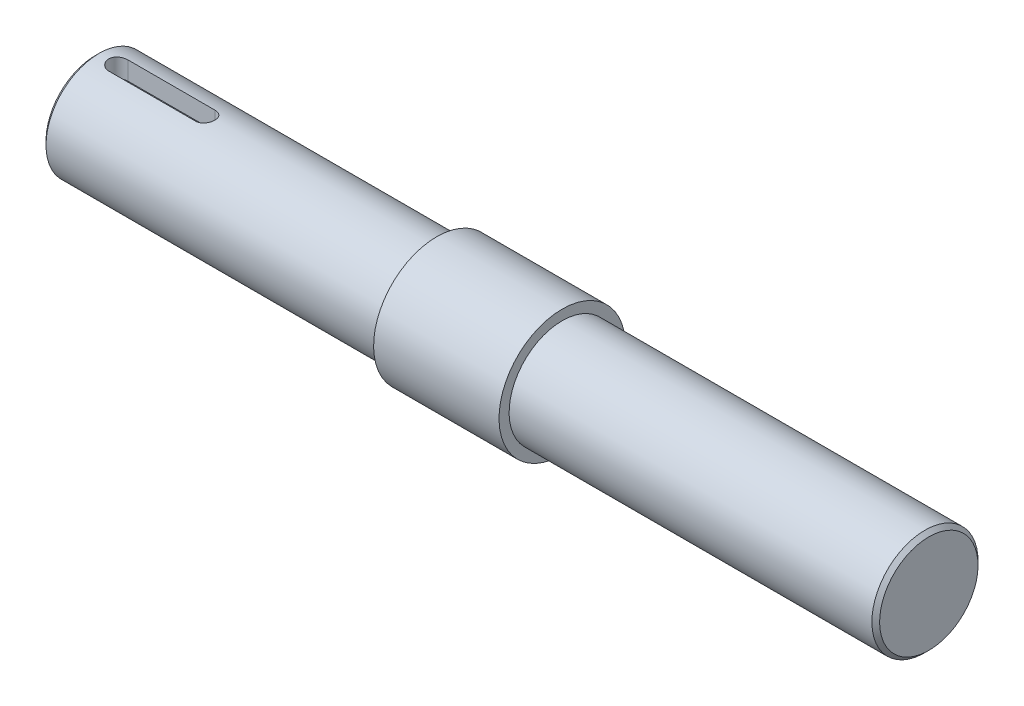
ISO-10303-21;
HEADER;
FILE_DESCRIPTION(('STEP AP214'),'2;1');
FILE_NAME('part.step','',(''),(''),'','','');
FILE_SCHEMA(('AUTOMOTIVE_DESIGN { 1 0 10303 214 1 1 1 1 }'));
ENDSEC;
DATA;
#1=APPLICATION_CONTEXT('core data for automotive mechanical design processes');
#2=APPLICATION_PROTOCOL_DEFINITION('international standard','automotive_design',2000,#1);
#3=PRODUCT_CONTEXT('',#1,'mechanical');
#4=PRODUCT('Part','Part','',(#3));
#5=PRODUCT_RELATED_PRODUCT_CATEGORY('part','',(#4));
#6=PRODUCT_DEFINITION_FORMATION('','',#4);
#7=PRODUCT_DEFINITION_CONTEXT('part definition',#1,'design');
#8=PRODUCT_DEFINITION('design','',#6,#7);
#9=PRODUCT_DEFINITION_SHAPE('','',#8);
#10=(LENGTH_UNIT() NAMED_UNIT(*) SI_UNIT(.MILLI.,.METRE.));
#11=(NAMED_UNIT(*) PLANE_ANGLE_UNIT() SI_UNIT($,.RADIAN.));
#12=(NAMED_UNIT(*) SI_UNIT($,.STERADIAN.) SOLID_ANGLE_UNIT());
#13=UNCERTAINTY_MEASURE_WITH_UNIT(LENGTH_MEASURE(1.E-05),#10,'distance_accuracy_value','');
#14=(GEOMETRIC_REPRESENTATION_CONTEXT(3) GLOBAL_UNCERTAINTY_ASSIGNED_CONTEXT((#13)) GLOBAL_UNIT_ASSIGNED_CONTEXT((#10,
#11,#12)) REPRESENTATION_CONTEXT('',''));
#15=CARTESIAN_POINT('',(0.,0.,0.));
#16=DIRECTION('',(0.,0.,1.));
#17=DIRECTION('',(1.,0.,0.));
#18=AXIS2_PLACEMENT_3D('',#15,#16,#17);
#19=CARTESIAN_POINT('',(432.,0.,0.));
#20=DIRECTION('',(1.,0.,0.));
#21=DIRECTION('',(0.,1.,0.));
#22=AXIS2_PLACEMENT_3D('',#19,#20,#21);
#23=CYLINDRICAL_SURFACE('',#22,27.5);
#24=CARTESIAN_POINT('',(11.9999999999999,27.0416345659799,-5.));
#25=CARTESIAN_POINT('',(11.8606128382279,27.0416233164666,-5.00001640047814));
#26=CARTESIAN_POINT('',(11.7212296097938,27.0427118990643,-4.99417207876341));
#27=CARTESIAN_POINT('',(11.4434835545277,27.0470071251589,-4.97088165476614));
#28=CARTESIAN_POINT('',(11.3051206169022,27.0502135351512,-4.95343683151582));
#29=CARTESIAN_POINT('',(11.0305858942771,27.0586570214069,-4.90709698702258));
#30=CARTESIAN_POINT('',(10.8944113512541,27.0638912918017,-4.87821778585737));
#31=CARTESIAN_POINT('',(10.6250227568617,27.0762343744052,-4.80923765177022));
#32=CARTESIAN_POINT('',(10.4918087089852,27.0833431888253,-4.76913670560913));
#33=CARTESIAN_POINT('',(10.2292763445926,27.0992304232334,-4.67801719247479));
#34=CARTESIAN_POINT('',(10.0999579225758,27.1080087979594,-4.62699892146665));
#35=CARTESIAN_POINT('',(9.84605587285056,27.126987322125,-4.51440118222781));
#36=CARTESIAN_POINT('',(9.7214740169367,27.137187997069,-4.4528178085087));
#37=CARTESIAN_POINT('',(9.47798148660962,27.1587163370771,-4.31956912661447));
#38=CARTESIAN_POINT('',(9.35906894048211,27.1700436263259,-4.24790717716446));
#39=CARTESIAN_POINT('',(9.12762439842264,27.1935154030165,-4.09496101451073));
#40=CARTESIAN_POINT('',(9.0150948030954,27.2056601942119,-4.01367321608594));
#41=CARTESIAN_POINT('',(8.79612162564765,27.2305505562545,-3.84119532707431));
#42=CARTESIAN_POINT('',(8.68975023312988,27.2433009237023,-3.74991426640209));
#43=CARTESIAN_POINT('',(8.48501344393681,27.2689348666358,-3.55872097822225));
#44=CARTESIAN_POINT('',(8.38665102741386,27.2818184897146,-3.45880556610794));
#45=CARTESIAN_POINT('',(8.19866770243193,27.3073516664494,-3.25107533173314));
#46=CARTESIAN_POINT('',(8.10904494230198,27.3200012692251,-3.14326219127829));
#47=CARTESIAN_POINT('',(7.93910636492097,27.344721337139,-2.92040850969684));
#48=CARTESIAN_POINT('',(7.85879399085384,27.356791587059,-2.80536531884152));
#49=CARTESIAN_POINT('',(7.70756988865483,27.3800901100507,-2.56806772558277));
#50=CARTESIAN_POINT('',(7.63672560208524,27.3913121183892,-2.44576971232371));
#51=CARTESIAN_POINT('',(7.50557885491204,27.4125086455947,-2.19548331573487));
#52=CARTESIAN_POINT('',(7.44528033841372,27.4224826973323,-2.06749282577724));
#53=CARTESIAN_POINT('',(7.33573794742342,27.440889636804,-1.80682984542478));
#54=CARTESIAN_POINT('',(7.28648871101171,27.4493232716902,-1.67415966228921));
#55=CARTESIAN_POINT('',(7.19937066271425,27.4644170112038,-1.40498439889688));
#56=CARTESIAN_POINT('',(7.16150598414174,27.4710764715942,-1.26847794545276));
#57=CARTESIAN_POINT('',(7.09784468584322,27.4823606318783,-0.994209294300366));
#58=CARTESIAN_POINT('',(7.071916679765,27.4870074493857,-0.85647865982843));
#59=CARTESIAN_POINT('',(7.03169017162005,27.4942493330537,-0.579279914156421));
#60=CARTESIAN_POINT('',(7.01739570895803,27.4968436865481,-0.439811216516837));
#61=CARTESIAN_POINT('',(6.9922294044753,27.501404034691,-0.0203195174243115));
#62=CARTESIAN_POINT('',(6.99900180906258,27.5001605528083,0.261103555587835));
#63=CARTESIAN_POINT('',(7.04412217673373,27.4920105356144,0.67718795433109));
#64=CARTESIAN_POINT('',(7.06478312204867,27.4882835238754,0.814143090322464));
#65=CARTESIAN_POINT('',(7.11736694870699,27.4788901096436,1.08581027780449));
#66=CARTESIAN_POINT('',(7.14928591521588,27.4732243813355,1.22052309200343));
#67=CARTESIAN_POINT('',(7.2241652729922,27.4601028621631,1.48679255054641));
#68=CARTESIAN_POINT('',(7.26712968356218,27.4526464197449,1.61834802688047));
#69=CARTESIAN_POINT('',(7.36375501863932,27.436153179664,1.87731765252218));
#70=CARTESIAN_POINT('',(7.4174121985139,27.427116935387,2.0047332335138));
#71=CARTESIAN_POINT('',(7.53537937265976,27.4076528760478,2.25531609557042));
#72=CARTESIAN_POINT('',(7.5997484820154,27.3972174049925,2.37845494357573));
#73=CARTESIAN_POINT('',(7.73843510646466,27.3752854002051,2.61883796914807));
#74=CARTESIAN_POINT('',(7.81274911070201,27.3637892413715,2.73608420698718));
#75=CARTESIAN_POINT('',(7.97085565103773,27.3400419841614,2.96399029182325));
#76=CARTESIAN_POINT('',(8.05465200429999,27.3277905826683,3.07464745880578));
#77=CARTESIAN_POINT('',(8.23109337974772,27.3028759360363,3.28854951460135));
#78=CARTESIAN_POINT('',(8.32373527430059,27.2902128375032,3.39179700089905));
#79=CARTESIAN_POINT('',(8.51869286365672,27.2646295970327,3.59169561893638));
#80=CARTESIAN_POINT('',(8.62113069796355,27.2517084121578,3.68822753777052));
#81=CARTESIAN_POINT('',(8.83375971072713,27.226162871145,3.87229760537683));
#82=CARTESIAN_POINT('',(8.94394807508932,27.2135384094701,3.95983899035784));
#83=CARTESIAN_POINT('',(9.17143364810961,27.1889315001084,4.12541102090081));
#84=CARTESIAN_POINT('',(9.28873550446291,27.1769494820148,4.20343534591103));
#85=CARTESIAN_POINT('',(9.52953028193133,27.1539843352681,4.34932038207293));
#86=CARTESIAN_POINT('',(9.65302083300103,27.143000828688,4.41718494493949));
#87=CARTESIAN_POINT('',(9.90569215297537,27.1223198674719,4.54244505751223));
#88=CARTESIAN_POINT('',(10.0348863152336,27.1126256806588,4.59981413912387));
#89=CARTESIAN_POINT('',(10.2977143615972,27.0948444484038,4.70342090080433));
#90=CARTESIAN_POINT('',(10.431346499839,27.0867567795107,4.74966290050536));
#91=CARTESIAN_POINT('',(10.7019935139081,27.0724320941726,4.83064296842775));
#92=CARTESIAN_POINT('',(10.8390046815424,27.06619313896,4.86539309278273));
#93=CARTESIAN_POINT('',(11.1154966857651,27.0557438612108,4.92316836190129));
#94=CARTESIAN_POINT('',(11.2549763088843,27.0515325691202,4.94619911073962));
#95=CARTESIAN_POINT('',(11.4955673094767,27.0461527550011,4.97551777241159));
#96=CARTESIAN_POINT('',(11.5963236210574,27.0444597239235,4.98470324196748));
#97=CARTESIAN_POINT('',(11.7980501313665,27.0422002158217,4.99694075356761));
#98=CARTESIAN_POINT('',(11.8990196840454,27.0416318462118,5.00000309972522));
#99=CARTESIAN_POINT('',(11.9999999999999,27.0416345659799,5.));
#100=B_SPLINE_CURVE_WITH_KNOTS('',3,(#24,#25,#26,#27,#28,#29,#30,#31,#32,#33,#34,#35,#36,#37,
#38,#39,#40,#41,#42,#43,#44,#45,#46,#47,#48,#49,#50,#51,#52,#53,#54,#55,#56,#57,#58,#59,#60,#61,
#62,#63,#64,#65,#66,#67,#68,#69,#70,#71,#72,#73,#74,#75,#76,#77,#78,#79,#80,#81,#82,#83,#84,#85,
#86,#87,#88,#89,#90,#91,#92,#93,#94,#95,#96,#97,#98,#99),.UNSPECIFIED.,.F.,.F.,(4,2,2,2,2,2,2,2,
2,2,2,2,2,2,2,2,2,2,2,2,2,2,2,2,2,2,2,2,2,2,2,2,2,2,2,2,2,4),(0.,0.418028889544115,
0.836011696271113,1.2534182108218,1.6708252178207,2.08822091048599,2.5057712311257,
2.92318272975173,3.3407501883926,3.76249715346803,4.18440034080537,4.60621394441415,
5.02818304958306,5.45301364237214,5.87800278309202,6.30278523972032,6.7277217334842,
7.14786204504041,7.56814817575974,8.4077631704868,8.82306163994095,9.23821583675365,
9.65352131748157,10.0686816120519,10.4862140001719,10.9035993733624,11.3211533687479,
11.7385602670734,12.1621002620017,12.5854872622686,13.0091539324112,13.4326595753262,
13.857218943326,14.2816132267324,14.7055608548527,15.1293055649834,15.4326883272686,
15.7355601198969),.UNSPECIFIED.);
#101=CARTESIAN_POINT('',(11.9999999999999,27.0416345659799,-5.));
#102=VERTEX_POINT('',#101);
#103=CARTESIAN_POINT('',(11.9999999999999,27.0416345659799,5.));
#104=VERTEX_POINT('',#103);
#105=EDGE_CURVE('E77',#102,#104,#100,.T.);
#106=ORIENTED_EDGE('',*,*,#105,.F.);
#107=DIRECTION('',(1.,0.,0.));
#108=VECTOR('',#107,1.);
#109=CARTESIAN_POINT('',(432.,27.0416345659799,-5.));
#110=LINE('',#109,#108);
#111=CARTESIAN_POINT('',(56.9999999999999,27.0416345659799,-5.));
#112=VERTEX_POINT('',#111);
#113=EDGE_CURVE('E13',#112,#102,#110,.F.);
#114=ORIENTED_EDGE('',*,*,#113,.F.);
#115=CARTESIAN_POINT('',(56.9999999999999,27.0416345659799,-5.));
#116=CARTESIAN_POINT('',(57.139387161772,27.0416233164666,-5.00001640047815));
#117=CARTESIAN_POINT('',(57.2787703902061,27.0427118990643,-4.99417207876341));
#118=CARTESIAN_POINT('',(57.5565164454722,27.0470071251589,-4.97088165476614));
#119=CARTESIAN_POINT('',(57.6948793830977,27.0502135351512,-4.95343683151582));
#120=CARTESIAN_POINT('',(57.9694141057228,27.0586570214069,-4.90709698702258));
#121=CARTESIAN_POINT('',(58.1055886487458,27.0638912918017,-4.87821778585738));
#122=CARTESIAN_POINT('',(58.3749772431382,27.0762343744052,-4.80923765177022));
#123=CARTESIAN_POINT('',(58.5081912910147,27.0833431888253,-4.76913670560913));
#124=CARTESIAN_POINT('',(58.7707236554073,27.0992304232334,-4.67801719247479));
#125=CARTESIAN_POINT('',(58.900042077424,27.1080087979594,-4.62699892146665));
#126=CARTESIAN_POINT('',(59.1539441271493,27.126987322125,-4.51440118222781));
#127=CARTESIAN_POINT('',(59.2785259830632,27.137187997069,-4.4528178085087));
#128=CARTESIAN_POINT('',(59.5220185133903,27.1587163370771,-4.31956912661447));
#129=CARTESIAN_POINT('',(59.6409310595178,27.1700436263259,-4.24790717716446));
#130=CARTESIAN_POINT('',(59.8723756015772,27.1935154030165,-4.09496101451073));
#131=CARTESIAN_POINT('',(59.9849051969045,27.2056601942119,-4.01367321608594));
#132=CARTESIAN_POINT('',(60.2038783743522,27.2305505562545,-3.84119532707431));
#133=CARTESIAN_POINT('',(60.31024976687,27.2433009237023,-3.74991426640209));
#134=CARTESIAN_POINT('',(60.5149865560631,27.2689348666358,-3.55872097822226));
#135=CARTESIAN_POINT('',(60.613348972586,27.2818184897146,-3.45880556610794));
#136=CARTESIAN_POINT('',(60.801332297568,27.3073516664494,-3.25107533173314));
#137=CARTESIAN_POINT('',(60.8909550576979,27.3200012692251,-3.14326219127829));
#138=CARTESIAN_POINT('',(61.0608936350789,27.344721337139,-2.92040850969684));
#139=CARTESIAN_POINT('',(61.141206009146,27.356791587059,-2.80536531884152));
#140=CARTESIAN_POINT('',(61.292430111345,27.3800901100507,-2.56806772558277));
#141=CARTESIAN_POINT('',(61.3632743979146,27.3913121183892,-2.44576971232371));
#142=CARTESIAN_POINT('',(61.4944211450878,27.4125086455947,-2.19548331573487));
#143=CARTESIAN_POINT('',(61.5547196615862,27.4224826973323,-2.06749282577724));
#144=CARTESIAN_POINT('',(61.6642620525765,27.440889636804,-1.80682984542478));
#145=CARTESIAN_POINT('',(61.7135112889882,27.4493232716902,-1.67415966228921));
#146=CARTESIAN_POINT('',(61.8006293372856,27.4644170112038,-1.40498439889688));
#147=CARTESIAN_POINT('',(61.8384940158581,27.4710764715942,-1.26847794545276));
#148=CARTESIAN_POINT('',(61.9021553141567,27.4823606318783,-0.994209294300368));
#149=CARTESIAN_POINT('',(61.9280833202349,27.4870074493857,-0.856478659828431));
#150=CARTESIAN_POINT('',(61.9683098283798,27.4942493330537,-0.579279914156422));
#151=CARTESIAN_POINT('',(61.9826042910419,27.4968436865481,-0.439811216516837));
#152=CARTESIAN_POINT('',(62.0077705955246,27.501404034691,-0.0203195174243112));
#153=CARTESIAN_POINT('',(62.0009981909373,27.5001605528083,0.261103555587837));
#154=CARTESIAN_POINT('',(61.9558778232661,27.4920105356144,0.677187954331091));
#155=CARTESIAN_POINT('',(61.9352168779512,27.4882835238754,0.814143090322465));
#156=CARTESIAN_POINT('',(61.8826330512929,27.4788901096436,1.08581027780449));
#157=CARTESIAN_POINT('',(61.850714084784,27.4732243813355,1.22052309200343));
#158=CARTESIAN_POINT('',(61.7758347270077,27.4601028621631,1.48679255054641));
#159=CARTESIAN_POINT('',(61.7328703164377,27.4526464197449,1.61834802688047));
#160=CARTESIAN_POINT('',(61.6362449813606,27.436153179664,1.87731765252218));
#161=CARTESIAN_POINT('',(61.582587801486,27.427116935387,2.0047332335138));
#162=CARTESIAN_POINT('',(61.4646206273401,27.4076528760478,2.25531609557042));
#163=CARTESIAN_POINT('',(61.4002515179845,27.3972174049925,2.37845494357573));
#164=CARTESIAN_POINT('',(61.2615648935352,27.3752854002051,2.61883796914807));
#165=CARTESIAN_POINT('',(61.1872508892979,27.3637892413715,2.73608420698718));
#166=CARTESIAN_POINT('',(61.0291443489622,27.3400419841614,2.96399029182324));
#167=CARTESIAN_POINT('',(60.9453479956999,27.3277905826683,3.07464745880577));
#168=CARTESIAN_POINT('',(60.7689066202522,27.3028759360363,3.28854951460134));
#169=CARTESIAN_POINT('',(60.6762647256993,27.2902128375032,3.39179700089905));
#170=CARTESIAN_POINT('',(60.4813071363432,27.2646295970327,3.59169561893638));
#171=CARTESIAN_POINT('',(60.3788693020363,27.2517084121578,3.68822753777052));
#172=CARTESIAN_POINT('',(60.1662402892727,27.226162871145,3.87229760537683));
#173=CARTESIAN_POINT('',(60.0560519249106,27.2135384094701,3.95983899035784));
#174=CARTESIAN_POINT('',(59.8285663518903,27.1889315001084,4.12541102090081));
#175=CARTESIAN_POINT('',(59.711264495537,27.1769494820148,4.20343534591103));
#176=CARTESIAN_POINT('',(59.4704697180686,27.1539843352681,4.34932038207293));
#177=CARTESIAN_POINT('',(59.3469791669989,27.143000828688,4.41718494493949));
#178=CARTESIAN_POINT('',(59.0943078470245,27.1223198674719,4.54244505751224));
#179=CARTESIAN_POINT('',(58.9651136847663,27.1126256806588,4.59981413912387));
#180=CARTESIAN_POINT('',(58.7022856384026,27.0948444484038,4.70342090080433));
#181=CARTESIAN_POINT('',(58.5686535001609,27.0867567795107,4.74966290050536));
#182=CARTESIAN_POINT('',(58.2980064860918,27.0724320941726,4.83064296842776));
#183=CARTESIAN_POINT('',(58.1609953184575,27.06619313896,4.86539309278273));
#184=CARTESIAN_POINT('',(57.8845033142348,27.0557438612108,4.92316836190129));
#185=CARTESIAN_POINT('',(57.7450236911156,27.0515325691202,4.94619911073962));
#186=CARTESIAN_POINT('',(57.5044326905232,27.0461527550011,4.97551777241159));
#187=CARTESIAN_POINT('',(57.4036763789425,27.0444597239235,4.98470324196748));
#188=CARTESIAN_POINT('',(57.2019498686334,27.0422002158217,4.99694075356762));
#189=CARTESIAN_POINT('',(57.1009803159545,27.0416318462118,5.00000309972522));
#190=CARTESIAN_POINT('',(56.9999999999999,27.0416345659799,5.));
#191=B_SPLINE_CURVE_WITH_KNOTS('',3,(#115,#116,#117,#118,#119,#120,#121,#122,#123,#124,#125,
#126,#127,#128,#129,#130,#131,#132,#133,#134,#135,#136,#137,#138,#139,#140,#141,#142,#143,#144,
#145,#146,#147,#148,#149,#150,#151,#152,#153,#154,#155,#156,#157,#158,#159,#160,#161,#162,#163,
#164,#165,#166,#167,#168,#169,#170,#171,#172,#173,#174,#175,#176,#177,#178,#179,#180,#181,#182,
#183,#184,#185,#186,#187,#188,#189,#190),.UNSPECIFIED.,.F.,.F.,(4,2,2,2,2,2,2,2,2,2,2,2,2,2,2,2,
2,2,2,2,2,2,2,2,2,2,2,2,2,2,2,2,2,2,2,2,2,4),(0.,0.418028889544115,0.836011696271111,
1.25341821082179,1.6708252178207,2.08822091048599,2.5057712311257,2.92318272975173,
3.3407501883926,3.76249715346803,4.18440034080538,4.60621394441415,5.02818304958306,
5.45301364237214,5.87800278309202,6.30278523972031,6.7277217334842,7.14786204504041,
7.56814817575975,8.4077631704868,8.82306163994095,9.23821583675365,9.65352131748157,
10.0686816120519,10.4862140001719,10.9035993733624,11.3211533687479,11.7385602670734,
12.1621002620017,12.5854872622686,13.0091539324112,13.4326595753262,13.857218943326,
14.2816132267324,14.7055608548527,15.1293055649834,15.4326883272686,15.7355601198969),.UNSPECIFIED.);
#192=CARTESIAN_POINT('',(56.9999999999999,27.0416345659799,5.));
#193=VERTEX_POINT('',#192);
#194=EDGE_CURVE('E148',#112,#193,#191,.T.);
#195=ORIENTED_EDGE('',*,*,#194,.T.);
#196=DIRECTION('',(1.,0.,0.));
#197=VECTOR('',#196,1.);
#198=CARTESIAN_POINT('',(432.,27.0416345659799,5.));
#199=LINE('',#198,#197);
#200=EDGE_CURVE('E63',#193,#104,#199,.F.);
#201=ORIENTED_EDGE('',*,*,#200,.T.);
#202=EDGE_LOOP('',(#106,#114,#195,#201));
#203=FACE_BOUND('',#202,.T.);
#204=CARTESIAN_POINT('',(1.99999999999995,0.,0.));
#205=DIRECTION('',(-1.,0.,0.));
#206=DIRECTION('',(0.,-1.,0.));
#207=AXIS2_PLACEMENT_3D('',#204,#205,#206);
#208=CIRCLE('',#207,27.5);
#209=CARTESIAN_POINT('',(1.99999999999995,-27.5,0.));
#210=VERTEX_POINT('',#209);
#211=EDGE_CURVE('E142',#210,#210,#208,.F.);
#212=ORIENTED_EDGE('',*,*,#211,.T.);
#213=EDGE_LOOP('',(#212));
#214=FACE_BOUND('',#213,.T.);
#215=CARTESIAN_POINT('',(177.,0.,0.));
#216=DIRECTION('',(1.,0.,0.));
#217=DIRECTION('',(0.,1.,0.));
#218=AXIS2_PLACEMENT_3D('',#215,#216,#217);
#219=CIRCLE('',#218,27.5);
#220=CARTESIAN_POINT('',(177.,27.5,0.));
#221=VERTEX_POINT('',#220);
#222=EDGE_CURVE('E133',#221,#221,#219,.T.);
#223=ORIENTED_EDGE('',*,*,#222,.F.);
#224=EDGE_LOOP('',(#223));
#225=FACE_BOUND('',#224,.T.);
#226=ADVANCED_FACE('F55',(#203,#214,#225),#23,.T.);
#227=CARTESIAN_POINT('',(0.,0.,0.));
#228=DIRECTION('',(-1.,0.,0.));
#229=DIRECTION('',(0.,-1.,0.));
#230=AXIS2_PLACEMENT_3D('',#227,#228,#229);
#231=PLANE('',#230);
#232=CARTESIAN_POINT('',(0.,0.,0.));
#233=DIRECTION('',(-1.,0.,0.));
#234=DIRECTION('',(0.,-1.,0.));
#235=AXIS2_PLACEMENT_3D('',#232,#233,#234);
#236=CIRCLE('',#235,25.5);
#237=CARTESIAN_POINT('',(0.,-25.5,0.));
#238=VERTEX_POINT('',#237);
#239=EDGE_CURVE('E145',#238,#238,#236,.T.);
#240=ORIENTED_EDGE('',*,*,#239,.T.);
#241=EDGE_LOOP('',(#240));
#242=FACE_BOUND('',#241,.T.);
#243=ADVANCED_FACE('F195',(#242),#231,.T.);
#244=CARTESIAN_POINT('',(177.,27.5,0.));
#245=DIRECTION('',(-1.,0.,0.));
#246=DIRECTION('',(0.,-1.,0.));
#247=AXIS2_PLACEMENT_3D('',#244,#245,#246);
#248=PLANE('',#247);
#249=ORIENTED_EDGE('',*,*,#222,.T.);
#250=EDGE_LOOP('',(#249));
#251=FACE_BOUND('',#250,.T.);
#252=CARTESIAN_POINT('',(177.,0.,0.));
#253=DIRECTION('',(1.,0.,0.));
#254=DIRECTION('',(0.,1.,0.));
#255=AXIS2_PLACEMENT_3D('',#252,#253,#254);
#256=CIRCLE('',#255,32.725);
#257=CARTESIAN_POINT('',(177.,32.725,0.));
#258=VERTEX_POINT('',#257);
#259=EDGE_CURVE('E130',#258,#258,#256,.T.);
#260=ORIENTED_EDGE('',*,*,#259,.F.);
#261=EDGE_LOOP('',(#260));
#262=FACE_BOUND('',#261,.T.);
#263=ADVANCED_FACE('F192',(#251,#262),#248,.T.);
#264=CARTESIAN_POINT('',(432.,0.,0.));
#265=DIRECTION('',(1.,0.,0.));
#266=DIRECTION('',(0.,1.,0.));
#267=AXIS2_PLACEMENT_3D('',#264,#265,#266);
#268=CYLINDRICAL_SURFACE('',#267,32.725);
#269=ORIENTED_EDGE('',*,*,#259,.T.);
#270=EDGE_LOOP('',(#269));
#271=FACE_BOUND('',#270,.T.);
#272=CARTESIAN_POINT('',(242.,0.,0.));
#273=DIRECTION('',(1.,0.,0.));
#274=DIRECTION('',(0.,1.,0.));
#275=AXIS2_PLACEMENT_3D('',#272,#273,#274);
#276=CIRCLE('',#275,32.725);
#277=CARTESIAN_POINT('',(242.,32.725,0.));
#278=VERTEX_POINT('',#277);
#279=EDGE_CURVE('E127',#278,#278,#276,.T.);
#280=ORIENTED_EDGE('',*,*,#279,.F.);
#281=EDGE_LOOP('',(#280));
#282=FACE_BOUND('',#281,.T.);
#283=ADVANCED_FACE('F189',(#271,#282),#268,.T.);
#284=CARTESIAN_POINT('',(242.,32.725,0.));
#285=DIRECTION('',(1.,0.,0.));
#286=DIRECTION('',(0.,1.,0.));
#287=AXIS2_PLACEMENT_3D('',#284,#285,#286);
#288=PLANE('',#287);
#289=ORIENTED_EDGE('',*,*,#279,.T.);
#290=EDGE_LOOP('',(#289));
#291=FACE_BOUND('',#290,.T.);
#292=CARTESIAN_POINT('',(242.,0.,0.));
#293=DIRECTION('',(1.,0.,0.));
#294=DIRECTION('',(0.,1.,0.));
#295=AXIS2_PLACEMENT_3D('',#292,#293,#294);
#296=CIRCLE('',#295,27.5);
#297=CARTESIAN_POINT('',(242.,27.5,0.));
#298=VERTEX_POINT('',#297);
#299=EDGE_CURVE('E120',#298,#298,#296,.T.);
#300=ORIENTED_EDGE('',*,*,#299,.F.);
#301=EDGE_LOOP('',(#300));
#302=FACE_BOUND('',#301,.T.);
#303=ADVANCED_FACE('F185',(#291,#302),#288,.T.);
#304=CARTESIAN_POINT('',(432.,0.,0.));
#305=DIRECTION('',(1.,0.,0.));
#306=DIRECTION('',(0.,1.,0.));
#307=AXIS2_PLACEMENT_3D('',#304,#305,#306);
#308=CYLINDRICAL_SURFACE('',#307,27.5);
#309=CARTESIAN_POINT('',(430.,0.,0.));
#310=DIRECTION('',(1.,0.,0.));
#311=DIRECTION('',(0.,1.,0.));
#312=AXIS2_PLACEMENT_3D('',#309,#310,#311);
#313=CIRCLE('',#312,27.5);
#314=CARTESIAN_POINT('',(430.,27.5,0.));
#315=VERTEX_POINT('',#314);
#316=EDGE_CURVE('E139',#315,#315,#313,.F.);
#317=ORIENTED_EDGE('',*,*,#316,.T.);
#318=EDGE_LOOP('',(#317));
#319=FACE_BOUND('',#318,.T.);
#320=ORIENTED_EDGE('',*,*,#299,.T.);
#321=EDGE_LOOP('',(#320));
#322=FACE_BOUND('',#321,.T.);
#323=ADVANCED_FACE('F181',(#319,#322),#308,.T.);
#324=CARTESIAN_POINT('',(432.,27.5,0.));
#325=DIRECTION('',(1.,0.,0.));
#326=DIRECTION('',(0.,1.,0.));
#327=AXIS2_PLACEMENT_3D('',#324,#325,#326);
#328=PLANE('',#327);
#329=CARTESIAN_POINT('',(432.,0.,0.));
#330=DIRECTION('',(1.,0.,0.));
#331=DIRECTION('',(0.,1.,0.));
#332=AXIS2_PLACEMENT_3D('',#329,#330,#331);
#333=CIRCLE('',#332,25.5);
#334=CARTESIAN_POINT('',(432.,25.5,0.));
#335=VERTEX_POINT('',#334);
#336=EDGE_CURVE('E136',#335,#335,#333,.T.);
#337=ORIENTED_EDGE('',*,*,#336,.T.);
#338=EDGE_LOOP('',(#337));
#339=FACE_BOUND('',#338,.T.);
#340=ADVANCED_FACE('F177',(#339),#328,.T.);
#341=CARTESIAN_POINT('',(432.,0.,0.));
#342=DIRECTION('',(-1.,0.,0.));
#343=DIRECTION('',(0.,-1.,0.));
#344=AXIS2_PLACEMENT_3D('',#341,#342,#343);
#345=CONICAL_SURFACE('',#344,25.5,0.785398163397446);
#346=ORIENTED_EDGE('',*,*,#316,.F.);
#347=EDGE_LOOP('',(#346));
#348=FACE_BOUND('',#347,.T.);
#349=ORIENTED_EDGE('',*,*,#336,.F.);
#350=EDGE_LOOP('',(#349));
#351=FACE_BOUND('',#350,.T.);
#352=ADVANCED_FACE('F180',(#348,#351),#345,.T.);
#353=CARTESIAN_POINT('',(1.99999999999995,0.,0.));
#354=DIRECTION('',(1.,0.,0.));
#355=DIRECTION('',(0.,1.,0.));
#356=AXIS2_PLACEMENT_3D('',#353,#354,#355);
#357=CONICAL_SURFACE('',#356,27.5,0.785398163397456);
#358=ORIENTED_EDGE('',*,*,#239,.F.);
#359=EDGE_LOOP('',(#358));
#360=FACE_BOUND('',#359,.T.);
#361=ORIENTED_EDGE('',*,*,#211,.F.);
#362=EDGE_LOOP('',(#361));
#363=FACE_BOUND('',#362,.T.);
#364=ADVANCED_FACE('F57',(#360,#363),#357,.T.);
#365=CARTESIAN_POINT('',(11.9999999999999,17.5,0.));
#366=DIRECTION('',(0.,1.,0.));
#367=DIRECTION('',(0.,0.,1.));
#368=AXIS2_PLACEMENT_3D('',#365,#366,#367);
#369=CYLINDRICAL_SURFACE('',#368,5.);
#370=DIRECTION('',(0.,1.,0.));
#371=VECTOR('',#370,1.);
#372=CARTESIAN_POINT('',(11.9999999999999,17.5,-5.));
#373=LINE('',#372,#371);
#374=CARTESIAN_POINT('',(11.9999999999999,17.5,-5.));
#375=VERTEX_POINT('',#374);
#376=EDGE_CURVE('E118',#375,#102,#373,.T.);
#377=ORIENTED_EDGE('',*,*,#376,.T.);
#378=ORIENTED_EDGE('',*,*,#105,.T.);
#379=DIRECTION('',(0.,1.,0.));
#380=VECTOR('',#379,1.);
#381=CARTESIAN_POINT('',(11.9999999999999,17.5,5.));
#382=LINE('',#381,#380);
#383=CARTESIAN_POINT('',(11.9999999999999,17.5,5.));
#384=VERTEX_POINT('',#383);
#385=EDGE_CURVE('E70',#384,#104,#382,.T.);
#386=ORIENTED_EDGE('',*,*,#385,.F.);
#387=CARTESIAN_POINT('',(11.9999999999999,17.5,0.));
#388=DIRECTION('',(0.,1.,0.));
#389=DIRECTION('',(0.,0.,1.));
#390=AXIS2_PLACEMENT_3D('',#387,#388,#389);
#391=CIRCLE('',#390,5.);
#392=EDGE_CURVE('E103',#375,#384,#391,.T.);
#393=ORIENTED_EDGE('',*,*,#392,.F.);
#394=EDGE_LOOP('',(#377,#378,#386,#393));
#395=FACE_BOUND('',#394,.T.);
#396=ADVANCED_FACE('F108',(#395),#369,.F.);
#397=CARTESIAN_POINT('',(0.,17.5,-5.));
#398=DIRECTION('',(0.,0.,-1.));
#399=DIRECTION('',(-1.,0.,0.));
#400=AXIS2_PLACEMENT_3D('',#397,#398,#399);
#401=PLANE('',#400);
#402=ORIENTED_EDGE('',*,*,#113,.T.);
#403=ORIENTED_EDGE('',*,*,#376,.F.);
#404=DIRECTION('',(-1.,0.,0.));
#405=VECTOR('',#404,1.);
#406=CARTESIAN_POINT('',(0.,17.5,-5.));
#407=LINE('',#406,#405);
#408=CARTESIAN_POINT('',(56.9999999999999,17.5,-5.));
#409=VERTEX_POINT('',#408);
#410=EDGE_CURVE('E110',#409,#375,#407,.T.);
#411=ORIENTED_EDGE('',*,*,#410,.F.);
#412=DIRECTION('',(0.,1.,0.));
#413=VECTOR('',#412,1.);
#414=CARTESIAN_POINT('',(56.9999999999999,17.5,-5.));
#415=LINE('',#414,#413);
#416=EDGE_CURVE('E121',#409,#112,#415,.T.);
#417=ORIENTED_EDGE('',*,*,#416,.T.);
#418=EDGE_LOOP('',(#402,#403,#411,#417));
#419=FACE_BOUND('',#418,.T.);
#420=ADVANCED_FACE('F170',(#419),#401,.F.);
#421=CARTESIAN_POINT('',(56.9999999999999,17.5,0.));
#422=DIRECTION('',(0.,1.,0.));
#423=DIRECTION('',(0.,0.,1.));
#424=AXIS2_PLACEMENT_3D('',#421,#422,#423);
#425=CYLINDRICAL_SURFACE('',#424,5.);
#426=ORIENTED_EDGE('',*,*,#416,.F.);
#427=CARTESIAN_POINT('',(56.9999999999999,17.5,0.));
#428=DIRECTION('',(0.,1.,0.));
#429=DIRECTION('',(0.,0.,1.));
#430=AXIS2_PLACEMENT_3D('',#427,#428,#429);
#431=CIRCLE('',#430,5.);
#432=CARTESIAN_POINT('',(56.9999999999999,17.5,5.));
#433=VERTEX_POINT('',#432);
#434=EDGE_CURVE('E102',#409,#433,#431,.F.);
#435=ORIENTED_EDGE('',*,*,#434,.T.);
#436=DIRECTION('',(0.,1.,0.));
#437=VECTOR('',#436,1.);
#438=CARTESIAN_POINT('',(56.9999999999999,17.5,5.));
#439=LINE('',#438,#437);
#440=EDGE_CURVE('E98',#433,#193,#439,.T.);
#441=ORIENTED_EDGE('',*,*,#440,.T.);
#442=ORIENTED_EDGE('',*,*,#194,.F.);
#443=EDGE_LOOP('',(#426,#435,#441,#442));
#444=FACE_BOUND('',#443,.T.);
#445=ADVANCED_FACE('F165',(#444),#425,.F.);
#446=CARTESIAN_POINT('',(0.,17.5,5.));
#447=DIRECTION('',(0.,0.,-1.));
#448=DIRECTION('',(-1.,0.,0.));
#449=AXIS2_PLACEMENT_3D('',#446,#447,#448);
#450=PLANE('',#449);
#451=ORIENTED_EDGE('',*,*,#440,.F.);
#452=DIRECTION('',(-1.,0.,0.));
#453=VECTOR('',#452,1.);
#454=CARTESIAN_POINT('',(0.,17.5,5.));
#455=LINE('',#454,#453);
#456=EDGE_CURVE('E95',#433,#384,#455,.T.);
#457=ORIENTED_EDGE('',*,*,#456,.T.);
#458=ORIENTED_EDGE('',*,*,#385,.T.);
#459=ORIENTED_EDGE('',*,*,#200,.F.);
#460=EDGE_LOOP('',(#451,#457,#458,#459));
#461=FACE_BOUND('',#460,.T.);
#462=ADVANCED_FACE('F96',(#461),#450,.T.);
#463=CARTESIAN_POINT('',(0.,17.5,0.));
#464=DIRECTION('',(0.,1.,0.));
#465=DIRECTION('',(0.,0.,1.));
#466=AXIS2_PLACEMENT_3D('',#463,#464,#465);
#467=PLANE('',#466);
#468=ORIENTED_EDGE('',*,*,#392,.T.);
#469=ORIENTED_EDGE('',*,*,#456,.F.);
#470=ORIENTED_EDGE('',*,*,#434,.F.);
#471=ORIENTED_EDGE('',*,*,#410,.T.);
#472=EDGE_LOOP('',(#468,#469,#470,#471));
#473=FACE_BOUND('',#472,.T.);
#474=ADVANCED_FACE('F112',(#473),#467,.T.);
#475=CLOSED_SHELL('',(#226,#243,#263,#283,#303,#323,#340,#352,#364,#396,#420,#445,#462,#474));
#476=MANIFOLD_SOLID_BREP('B2',#475);
#477=ADVANCED_BREP_SHAPE_REPRESENTATION('',(#18,#476),#14);
#478=SHAPE_DEFINITION_REPRESENTATION(#9,#477);
ENDSEC;
END-ISO-10303-21;
